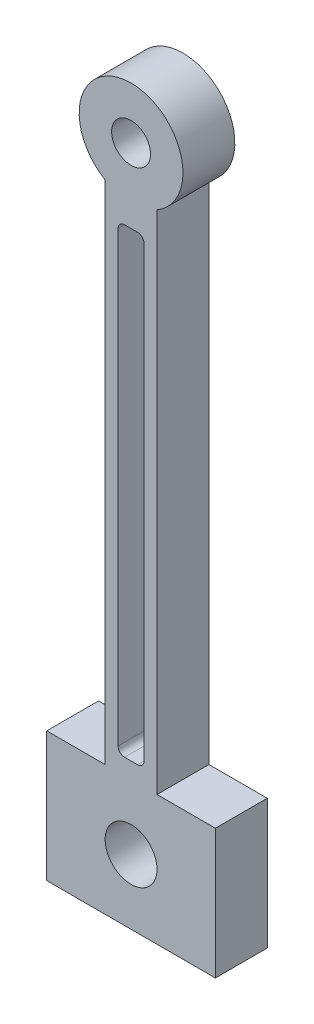
ISO-10303-21;
HEADER;
FILE_DESCRIPTION(('STEP AP214'),'2;1');
FILE_NAME('part.step','',(''),(''),'','','');
FILE_SCHEMA(('AUTOMOTIVE_DESIGN { 1 0 10303 214 1 1 1 1 }'));
ENDSEC;
DATA;
#1=APPLICATION_CONTEXT('core data for automotive mechanical design processes');
#2=APPLICATION_PROTOCOL_DEFINITION('international standard','automotive_design',2000,#1);
#3=PRODUCT_CONTEXT('',#1,'mechanical');
#4=PRODUCT('Part','Part','',(#3));
#5=PRODUCT_RELATED_PRODUCT_CATEGORY('part','',(#4));
#6=PRODUCT_DEFINITION_FORMATION('','',#4);
#7=PRODUCT_DEFINITION_CONTEXT('part definition',#1,'design');
#8=PRODUCT_DEFINITION('design','',#6,#7);
#9=PRODUCT_DEFINITION_SHAPE('','',#8);
#10=(LENGTH_UNIT() NAMED_UNIT(*) SI_UNIT(.MILLI.,.METRE.));
#11=(NAMED_UNIT(*) PLANE_ANGLE_UNIT() SI_UNIT($,.RADIAN.));
#12=(NAMED_UNIT(*) SI_UNIT($,.STERADIAN.) SOLID_ANGLE_UNIT());
#13=UNCERTAINTY_MEASURE_WITH_UNIT(LENGTH_MEASURE(1.E-05),#10,'distance_accuracy_value','');
#14=(GEOMETRIC_REPRESENTATION_CONTEXT(3) GLOBAL_UNCERTAINTY_ASSIGNED_CONTEXT((#13)) GLOBAL_UNIT_ASSIGNED_CONTEXT((#10,
#11,#12)) REPRESENTATION_CONTEXT('',''));
#15=CARTESIAN_POINT('',(0.,0.,0.));
#16=DIRECTION('',(0.,0.,1.));
#17=DIRECTION('',(1.,0.,0.));
#18=AXIS2_PLACEMENT_3D('',#15,#16,#17);
#19=CARTESIAN_POINT('',(-2.,0.,8.));
#20=DIRECTION('',(1.,0.,0.));
#21=DIRECTION('',(0.,1.,0.));
#22=AXIS2_PLACEMENT_3D('',#19,#20,#21);
#23=PLANE('',#22);
#24=DIRECTION('',(0.,-1.,0.));
#25=VECTOR('',#24,1.);
#26=CARTESIAN_POINT('',(-2.,0.,0.));
#27=LINE('',#26,#25);
#28=CARTESIAN_POINT('',(-2.,-12.4309632275777,0.));
#29=VERTEX_POINT('',#28);
#30=CARTESIAN_POINT('',(-1.99999999999999,-81.5205417627153,0.));
#31=VERTEX_POINT('',#30);
#32=EDGE_CURVE('E219',#29,#31,#27,.T.);
#33=ORIENTED_EDGE('',*,*,#32,.F.);
#34=DIRECTION('',(0.,0.,-1.));
#35=VECTOR('',#34,1.);
#36=CARTESIAN_POINT('',(-2.,-12.4309632275777,8.));
#37=LINE('',#36,#35);
#38=CARTESIAN_POINT('',(-2.,-12.4309632275777,8.));
#39=VERTEX_POINT('',#38);
#40=EDGE_CURVE('E11',#39,#29,#37,.T.);
#41=ORIENTED_EDGE('',*,*,#40,.F.);
#42=DIRECTION('',(0.,-1.,0.));
#43=VECTOR('',#42,1.);
#44=CARTESIAN_POINT('',(-2.,0.,8.));
#45=LINE('',#44,#43);
#46=CARTESIAN_POINT('',(-1.99999999999999,-81.5205417627153,8.));
#47=VERTEX_POINT('',#46);
#48=EDGE_CURVE('E556',#39,#47,#45,.T.);
#49=ORIENTED_EDGE('',*,*,#48,.T.);
#50=DIRECTION('',(0.,0.,-1.));
#51=VECTOR('',#50,1.);
#52=CARTESIAN_POINT('',(-1.99999999999999,-81.5205417627153,8.));
#53=LINE('',#52,#51);
#54=EDGE_CURVE('E59',#47,#31,#53,.T.);
#55=ORIENTED_EDGE('',*,*,#54,.T.);
#56=EDGE_LOOP('',(#33,#41,#49,#55));
#57=FACE_BOUND('',#56,.T.);
#58=ADVANCED_FACE('F40',(#57),#23,.T.);
#59=CARTESIAN_POINT('',(-1.,-12.4309632275777,8.));
#60=DIRECTION('',(0.,0.,-1.));
#61=DIRECTION('',(-1.,0.,0.));
#62=AXIS2_PLACEMENT_3D('',#59,#60,#61);
#63=CYLINDRICAL_SURFACE('',#62,1.);
#64=CARTESIAN_POINT('',(-1.,-12.4309632275777,0.));
#65=DIRECTION('',(0.,0.,1.));
#66=DIRECTION('',(1.,0.,0.));
#67=AXIS2_PLACEMENT_3D('',#64,#65,#66);
#68=CIRCLE('',#67,1.);
#69=CARTESIAN_POINT('',(-0.999999999999992,-11.4309632275777,0.));
#70=VERTEX_POINT('',#69);
#71=EDGE_CURVE('E221',#29,#70,#68,.F.);
#72=ORIENTED_EDGE('',*,*,#71,.T.);
#73=DIRECTION('',(0.,0.,-1.));
#74=VECTOR('',#73,1.);
#75=CARTESIAN_POINT('',(-0.999999999999992,-11.4309632275777,8.));
#76=LINE('',#75,#74);
#77=CARTESIAN_POINT('',(-0.999999999999992,-11.4309632275777,8.));
#78=VERTEX_POINT('',#77);
#79=EDGE_CURVE('E50',#78,#70,#76,.T.);
#80=ORIENTED_EDGE('',*,*,#79,.F.);
#81=CARTESIAN_POINT('',(-1.,-12.4309632275777,8.));
#82=DIRECTION('',(0.,0.,1.));
#83=DIRECTION('',(1.,0.,0.));
#84=AXIS2_PLACEMENT_3D('',#81,#82,#83);
#85=CIRCLE('',#84,1.);
#86=EDGE_CURVE('E551',#39,#78,#85,.F.);
#87=ORIENTED_EDGE('',*,*,#86,.F.);
#88=ORIENTED_EDGE('',*,*,#40,.T.);
#89=EDGE_LOOP('',(#72,#80,#87,#88));
#90=FACE_BOUND('',#89,.T.);
#91=ADVANCED_FACE('F316',(#90),#63,.F.);
#92=CARTESIAN_POINT('',(0.,-11.4309632275777,8.));
#93=DIRECTION('',(0.,1.,0.));
#94=DIRECTION('',(0.,0.,1.));
#95=AXIS2_PLACEMENT_3D('',#92,#93,#94);
#96=PLANE('',#95);
#97=DIRECTION('',(1.,0.,0.));
#98=VECTOR('',#97,1.);
#99=CARTESIAN_POINT('',(0.,-11.4309632275777,0.));
#100=LINE('',#99,#98);
#101=CARTESIAN_POINT('',(0.999999999999993,-11.4309632275777,0.));
#102=VERTEX_POINT('',#101);
#103=EDGE_CURVE('E224',#70,#102,#100,.T.);
#104=ORIENTED_EDGE('',*,*,#103,.T.);
#105=DIRECTION('',(0.,0.,-1.));
#106=VECTOR('',#105,1.);
#107=CARTESIAN_POINT('',(0.999999999999993,-11.4309632275777,8.));
#108=LINE('',#107,#106);
#109=CARTESIAN_POINT('',(0.999999999999993,-11.4309632275777,8.));
#110=VERTEX_POINT('',#109);
#111=EDGE_CURVE('E251',#110,#102,#108,.T.);
#112=ORIENTED_EDGE('',*,*,#111,.F.);
#113=DIRECTION('',(1.,0.,0.));
#114=VECTOR('',#113,1.);
#115=CARTESIAN_POINT('',(0.,-11.4309632275777,8.));
#116=LINE('',#115,#114);
#117=EDGE_CURVE('E549',#78,#110,#116,.T.);
#118=ORIENTED_EDGE('',*,*,#117,.F.);
#119=ORIENTED_EDGE('',*,*,#79,.T.);
#120=EDGE_LOOP('',(#104,#112,#118,#119));
#121=FACE_BOUND('',#120,.T.);
#122=ADVANCED_FACE('F321',(#121),#96,.F.);
#123=CARTESIAN_POINT('',(1.,-12.4309632275777,8.));
#124=DIRECTION('',(0.,0.,-1.));
#125=DIRECTION('',(-1.,0.,0.));
#126=AXIS2_PLACEMENT_3D('',#123,#124,#125);
#127=CYLINDRICAL_SURFACE('',#126,1.);
#128=CARTESIAN_POINT('',(1.,-12.4309632275777,0.));
#129=DIRECTION('',(0.,0.,1.));
#130=DIRECTION('',(1.,0.,0.));
#131=AXIS2_PLACEMENT_3D('',#128,#129,#130);
#132=CIRCLE('',#131,1.);
#133=CARTESIAN_POINT('',(2.,-12.4309632275777,0.));
#134=VERTEX_POINT('',#133);
#135=EDGE_CURVE('E227',#134,#102,#132,.T.);
#136=ORIENTED_EDGE('',*,*,#135,.F.);
#137=DIRECTION('',(0.,0.,-1.));
#138=VECTOR('',#137,1.);
#139=CARTESIAN_POINT('',(2.,-12.4309632275777,8.));
#140=LINE('',#139,#138);
#141=CARTESIAN_POINT('',(2.,-12.4309632275777,8.));
#142=VERTEX_POINT('',#141);
#143=EDGE_CURVE('E249',#142,#134,#140,.T.);
#144=ORIENTED_EDGE('',*,*,#143,.F.);
#145=CARTESIAN_POINT('',(1.,-12.4309632275777,8.));
#146=DIRECTION('',(0.,0.,1.));
#147=DIRECTION('',(1.,0.,0.));
#148=AXIS2_PLACEMENT_3D('',#145,#146,#147);
#149=CIRCLE('',#148,1.);
#150=EDGE_CURVE('E548',#142,#110,#149,.T.);
#151=ORIENTED_EDGE('',*,*,#150,.T.);
#152=ORIENTED_EDGE('',*,*,#111,.T.);
#153=EDGE_LOOP('',(#136,#144,#151,#152));
#154=FACE_BOUND('',#153,.T.);
#155=ADVANCED_FACE('F493',(#154),#127,.F.);
#156=CARTESIAN_POINT('',(2.,0.,8.));
#157=DIRECTION('',(1.,0.,0.));
#158=DIRECTION('',(0.,1.,0.));
#159=AXIS2_PLACEMENT_3D('',#156,#157,#158);
#160=PLANE('',#159);
#161=DIRECTION('',(0.,-1.,0.));
#162=VECTOR('',#161,1.);
#163=CARTESIAN_POINT('',(2.,0.,0.));
#164=LINE('',#163,#162);
#165=CARTESIAN_POINT('',(2.00000000000001,-81.5205417627153,0.));
#166=VERTEX_POINT('',#165);
#167=EDGE_CURVE('E230',#134,#166,#164,.T.);
#168=ORIENTED_EDGE('',*,*,#167,.T.);
#169=DIRECTION('',(0.,0.,-1.));
#170=VECTOR('',#169,1.);
#171=CARTESIAN_POINT('',(2.00000000000001,-81.5205417627153,8.));
#172=LINE('',#171,#170);
#173=CARTESIAN_POINT('',(2.00000000000001,-81.5205417627153,8.));
#174=VERTEX_POINT('',#173);
#175=EDGE_CURVE('E169',#174,#166,#172,.T.);
#176=ORIENTED_EDGE('',*,*,#175,.F.);
#177=DIRECTION('',(0.,-1.,0.));
#178=VECTOR('',#177,1.);
#179=CARTESIAN_POINT('',(2.,0.,8.));
#180=LINE('',#179,#178);
#181=EDGE_CURVE('E180',#142,#174,#180,.T.);
#182=ORIENTED_EDGE('',*,*,#181,.F.);
#183=ORIENTED_EDGE('',*,*,#143,.T.);
#184=EDGE_LOOP('',(#168,#176,#182,#183));
#185=FACE_BOUND('',#184,.T.);
#186=ADVANCED_FACE('F483',(#185),#160,.F.);
#187=CARTESIAN_POINT('',(1.00000000000001,-81.5205417627153,8.));
#188=DIRECTION('',(0.,0.,-1.));
#189=DIRECTION('',(-1.,0.,0.));
#190=AXIS2_PLACEMENT_3D('',#187,#188,#189);
#191=CYLINDRICAL_SURFACE('',#190,1.);
#192=CARTESIAN_POINT('',(1.00000000000001,-81.5205417627153,0.));
#193=DIRECTION('',(0.,0.,1.));
#194=DIRECTION('',(1.,0.,0.));
#195=AXIS2_PLACEMENT_3D('',#192,#193,#194);
#196=CIRCLE('',#195,1.);
#197=CARTESIAN_POINT('',(1.,-82.5205417627153,0.));
#198=VERTEX_POINT('',#197);
#199=EDGE_CURVE('E165',#198,#166,#196,.T.);
#200=ORIENTED_EDGE('',*,*,#199,.F.);
#201=DIRECTION('',(0.,0.,-1.));
#202=VECTOR('',#201,1.);
#203=CARTESIAN_POINT('',(1.,-82.5205417627153,8.));
#204=LINE('',#203,#202);
#205=CARTESIAN_POINT('',(1.,-82.5205417627153,8.));
#206=VERTEX_POINT('',#205);
#207=EDGE_CURVE('E160',#206,#198,#204,.T.);
#208=ORIENTED_EDGE('',*,*,#207,.F.);
#209=CARTESIAN_POINT('',(1.00000000000001,-81.5205417627153,8.));
#210=DIRECTION('',(0.,0.,1.));
#211=DIRECTION('',(1.,0.,0.));
#212=AXIS2_PLACEMENT_3D('',#209,#210,#211);
#213=CIRCLE('',#212,1.);
#214=EDGE_CURVE('E163',#206,#174,#213,.T.);
#215=ORIENTED_EDGE('',*,*,#214,.T.);
#216=ORIENTED_EDGE('',*,*,#175,.T.);
#217=EDGE_LOOP('',(#200,#208,#215,#216));
#218=FACE_BOUND('',#217,.T.);
#219=ADVANCED_FACE('F162',(#218),#191,.F.);
#220=CARTESIAN_POINT('',(0.,-82.5205417627153,8.));
#221=DIRECTION('',(0.,1.,0.));
#222=DIRECTION('',(0.,0.,1.));
#223=AXIS2_PLACEMENT_3D('',#220,#221,#222);
#224=PLANE('',#223);
#225=DIRECTION('',(1.,0.,0.));
#226=VECTOR('',#225,1.);
#227=CARTESIAN_POINT('',(0.,-82.5205417627153,0.));
#228=LINE('',#227,#226);
#229=CARTESIAN_POINT('',(-0.999999999999984,-82.5205417627153,0.));
#230=VERTEX_POINT('',#229);
#231=EDGE_CURVE('E234',#230,#198,#228,.T.);
#232=ORIENTED_EDGE('',*,*,#231,.F.);
#233=DIRECTION('',(0.,0.,-1.));
#234=VECTOR('',#233,1.);
#235=CARTESIAN_POINT('',(-0.999999999999984,-82.5205417627153,8.));
#236=LINE('',#235,#234);
#237=CARTESIAN_POINT('',(-0.999999999999984,-82.5205417627153,8.));
#238=VERTEX_POINT('',#237);
#239=EDGE_CURVE('E108',#238,#230,#236,.T.);
#240=ORIENTED_EDGE('',*,*,#239,.F.);
#241=DIRECTION('',(1.,0.,0.));
#242=VECTOR('',#241,1.);
#243=CARTESIAN_POINT('',(0.,-82.5205417627153,8.));
#244=LINE('',#243,#242);
#245=EDGE_CURVE('E177',#238,#206,#244,.T.);
#246=ORIENTED_EDGE('',*,*,#245,.T.);
#247=ORIENTED_EDGE('',*,*,#207,.T.);
#248=EDGE_LOOP('',(#232,#240,#246,#247));
#249=FACE_BOUND('',#248,.T.);
#250=ADVANCED_FACE('F183',(#249),#224,.T.);
#251=CARTESIAN_POINT('',(4.,0.,8.));
#252=DIRECTION('',(1.,0.,0.));
#253=DIRECTION('',(0.,1.,0.));
#254=AXIS2_PLACEMENT_3D('',#251,#252,#253);
#255=PLANE('',#254);
#256=DIRECTION('',(0.,-1.,0.));
#257=VECTOR('',#256,1.);
#258=CARTESIAN_POINT('',(4.,0.,0.));
#259=LINE('',#258,#257);
#260=CARTESIAN_POINT('',(4.,-6.92820323027551,0.));
#261=VERTEX_POINT('',#260);
#262=CARTESIAN_POINT('',(3.99999999999999,-85.,0.));
#263=VERTEX_POINT('',#262);
#264=EDGE_CURVE('E196',#261,#263,#259,.T.);
#265=ORIENTED_EDGE('',*,*,#264,.F.);
#266=DIRECTION('',(0.,0.,-1.));
#267=VECTOR('',#266,1.);
#268=CARTESIAN_POINT('',(4.,-6.92820323027551,8.));
#269=LINE('',#268,#267);
#270=CARTESIAN_POINT('',(4.,-6.92820323027551,8.));
#271=VERTEX_POINT('',#270);
#272=EDGE_CURVE('E44',#271,#261,#269,.T.);
#273=ORIENTED_EDGE('',*,*,#272,.F.);
#274=DIRECTION('',(0.,-1.,0.));
#275=VECTOR('',#274,1.);
#276=CARTESIAN_POINT('',(4.,0.,8.));
#277=LINE('',#276,#275);
#278=CARTESIAN_POINT('',(3.99999999999999,-85.,8.));
#279=VERTEX_POINT('',#278);
#280=EDGE_CURVE('E245',#271,#279,#277,.T.);
#281=ORIENTED_EDGE('',*,*,#280,.T.);
#282=DIRECTION('',(0.,0.,-1.));
#283=VECTOR('',#282,1.);
#284=CARTESIAN_POINT('',(3.99999999999999,-85.,8.));
#285=LINE('',#284,#283);
#286=EDGE_CURVE('E195',#279,#263,#285,.T.);
#287=ORIENTED_EDGE('',*,*,#286,.T.);
#288=EDGE_LOOP('',(#265,#273,#281,#287));
#289=FACE_BOUND('',#288,.T.);
#290=ADVANCED_FACE('F42',(#289),#255,.T.);
#291=CARTESIAN_POINT('',(0.,0.,8.));
#292=DIRECTION('',(0.,0.,-1.));
#293=DIRECTION('',(-1.,0.,0.));
#294=AXIS2_PLACEMENT_3D('',#291,#292,#293);
#295=CYLINDRICAL_SURFACE('',#294,8.);
#296=CARTESIAN_POINT('',(0.,0.,0.));
#297=DIRECTION('',(0.,0.,1.));
#298=DIRECTION('',(1.,0.,0.));
#299=AXIS2_PLACEMENT_3D('',#296,#297,#298);
#300=CIRCLE('',#299,8.);
#301=CARTESIAN_POINT('',(-4.,-6.92820323027551,0.));
#302=VERTEX_POINT('',#301);
#303=EDGE_CURVE('E199',#261,#302,#300,.T.);
#304=ORIENTED_EDGE('',*,*,#303,.T.);
#305=DIRECTION('',(0.,0.,-1.));
#306=VECTOR('',#305,1.);
#307=CARTESIAN_POINT('',(-4.,-6.92820323027551,8.));
#308=LINE('',#307,#306);
#309=CARTESIAN_POINT('',(-4.,-6.92820323027551,8.));
#310=VERTEX_POINT('',#309);
#311=EDGE_CURVE('E265',#310,#302,#308,.T.);
#312=ORIENTED_EDGE('',*,*,#311,.F.);
#313=CARTESIAN_POINT('',(0.,0.,8.));
#314=DIRECTION('',(0.,0.,1.));
#315=DIRECTION('',(1.,0.,0.));
#316=AXIS2_PLACEMENT_3D('',#313,#314,#315);
#317=CIRCLE('',#316,8.);
#318=EDGE_CURVE('E274',#271,#310,#317,.T.);
#319=ORIENTED_EDGE('',*,*,#318,.F.);
#320=ORIENTED_EDGE('',*,*,#272,.T.);
#321=EDGE_LOOP('',(#304,#312,#319,#320));
#322=FACE_BOUND('',#321,.T.);
#323=ADVANCED_FACE('F273',(#322),#295,.T.);
#324=CARTESIAN_POINT('',(-4.,0.,8.));
#325=DIRECTION('',(1.,0.,0.));
#326=DIRECTION('',(0.,1.,0.));
#327=AXIS2_PLACEMENT_3D('',#324,#325,#326);
#328=PLANE('',#327);
#329=DIRECTION('',(0.,-1.,0.));
#330=VECTOR('',#329,1.);
#331=CARTESIAN_POINT('',(-4.,0.,0.));
#332=LINE('',#331,#330);
#333=CARTESIAN_POINT('',(-3.99999999999999,-85.,0.));
#334=VERTEX_POINT('',#333);
#335=EDGE_CURVE('E201',#302,#334,#332,.T.);
#336=ORIENTED_EDGE('',*,*,#335,.T.);
#337=DIRECTION('',(0.,0.,-1.));
#338=VECTOR('',#337,1.);
#339=CARTESIAN_POINT('',(-3.99999999999999,-85.,8.));
#340=LINE('',#339,#338);
#341=CARTESIAN_POINT('',(-3.99999999999999,-85.,8.));
#342=VERTEX_POINT('',#341);
#343=EDGE_CURVE('E264',#342,#334,#340,.T.);
#344=ORIENTED_EDGE('',*,*,#343,.F.);
#345=DIRECTION('',(0.,-1.,0.));
#346=VECTOR('',#345,1.);
#347=CARTESIAN_POINT('',(-4.,0.,8.));
#348=LINE('',#347,#346);
#349=EDGE_CURVE('E566',#310,#342,#348,.T.);
#350=ORIENTED_EDGE('',*,*,#349,.F.);
#351=ORIENTED_EDGE('',*,*,#311,.T.);
#352=EDGE_LOOP('',(#336,#344,#350,#351));
#353=FACE_BOUND('',#352,.T.);
#354=ADVANCED_FACE('F306',(#353),#328,.F.);
#355=CARTESIAN_POINT('',(0.,-85.,8.));
#356=DIRECTION('',(0.,1.,0.));
#357=DIRECTION('',(0.,0.,1.));
#358=AXIS2_PLACEMENT_3D('',#355,#356,#357);
#359=PLANE('',#358);
#360=DIRECTION('',(1.,0.,0.));
#361=VECTOR('',#360,1.);
#362=CARTESIAN_POINT('',(0.,-85.,0.));
#363=LINE('',#362,#361);
#364=CARTESIAN_POINT('',(-13.,-85.,0.));
#365=VERTEX_POINT('',#364);
#366=EDGE_CURVE('E204',#365,#334,#363,.T.);
#367=ORIENTED_EDGE('',*,*,#366,.F.);
#368=DIRECTION('',(0.,0.,-1.));
#369=VECTOR('',#368,1.);
#370=CARTESIAN_POINT('',(-13.,-85.,8.));
#371=LINE('',#370,#369);
#372=CARTESIAN_POINT('',(-13.,-85.,8.));
#373=VERTEX_POINT('',#372);
#374=EDGE_CURVE('E262',#373,#365,#371,.T.);
#375=ORIENTED_EDGE('',*,*,#374,.F.);
#376=DIRECTION('',(1.,0.,0.));
#377=VECTOR('',#376,1.);
#378=CARTESIAN_POINT('',(0.,-85.,8.));
#379=LINE('',#378,#377);
#380=EDGE_CURVE('E305',#373,#342,#379,.T.);
#381=ORIENTED_EDGE('',*,*,#380,.T.);
#382=ORIENTED_EDGE('',*,*,#343,.T.);
#383=EDGE_LOOP('',(#367,#375,#381,#382));
#384=FACE_BOUND('',#383,.T.);
#385=ADVANCED_FACE('F300',(#384),#359,.T.);
#386=CARTESIAN_POINT('',(-13.,0.,8.));
#387=DIRECTION('',(1.,0.,0.));
#388=DIRECTION('',(0.,1.,0.));
#389=AXIS2_PLACEMENT_3D('',#386,#387,#388);
#390=PLANE('',#389);
#391=DIRECTION('',(0.,-1.,0.));
#392=VECTOR('',#391,1.);
#393=CARTESIAN_POINT('',(-13.,0.,0.));
#394=LINE('',#393,#392);
#395=CARTESIAN_POINT('',(-13.,-105.,0.));
#396=VERTEX_POINT('',#395);
#397=EDGE_CURVE('E207',#365,#396,#394,.T.);
#398=ORIENTED_EDGE('',*,*,#397,.T.);
#399=DIRECTION('',(0.,0.,-1.));
#400=VECTOR('',#399,1.);
#401=CARTESIAN_POINT('',(-13.,-105.,8.));
#402=LINE('',#401,#400);
#403=CARTESIAN_POINT('',(-13.,-105.,8.));
#404=VERTEX_POINT('',#403);
#405=EDGE_CURVE('E260',#404,#396,#402,.T.);
#406=ORIENTED_EDGE('',*,*,#405,.F.);
#407=DIRECTION('',(0.,-1.,0.));
#408=VECTOR('',#407,1.);
#409=CARTESIAN_POINT('',(-13.,0.,8.));
#410=LINE('',#409,#408);
#411=EDGE_CURVE('E563',#373,#404,#410,.T.);
#412=ORIENTED_EDGE('',*,*,#411,.F.);
#413=ORIENTED_EDGE('',*,*,#374,.T.);
#414=EDGE_LOOP('',(#398,#406,#412,#413));
#415=FACE_BOUND('',#414,.T.);
#416=ADVANCED_FACE('F313',(#415),#390,.F.);
#417=CARTESIAN_POINT('',(0.,-105.,8.));
#418=DIRECTION('',(0.,-1.,0.));
#419=DIRECTION('',(0.,0.,-1.));
#420=AXIS2_PLACEMENT_3D('',#417,#418,#419);
#421=PLANE('',#420);
#422=DIRECTION('',(-1.,0.,0.));
#423=VECTOR('',#422,1.);
#424=CARTESIAN_POINT('',(0.,-105.,0.));
#425=LINE('',#424,#423);
#426=CARTESIAN_POINT('',(13.,-105.,0.));
#427=VERTEX_POINT('',#426);
#428=EDGE_CURVE('E210',#427,#396,#425,.T.);
#429=ORIENTED_EDGE('',*,*,#428,.F.);
#430=DIRECTION('',(0.,0.,-1.));
#431=VECTOR('',#430,1.);
#432=CARTESIAN_POINT('',(13.,-105.,8.));
#433=LINE('',#432,#431);
#434=CARTESIAN_POINT('',(13.,-105.,8.));
#435=VERTEX_POINT('',#434);
#436=EDGE_CURVE('E258',#435,#427,#433,.T.);
#437=ORIENTED_EDGE('',*,*,#436,.F.);
#438=DIRECTION('',(-1.,0.,0.));
#439=VECTOR('',#438,1.);
#440=CARTESIAN_POINT('',(0.,-105.,8.));
#441=LINE('',#440,#439);
#442=EDGE_CURVE('E561',#435,#404,#441,.T.);
#443=ORIENTED_EDGE('',*,*,#442,.T.);
#444=ORIENTED_EDGE('',*,*,#405,.T.);
#445=EDGE_LOOP('',(#429,#437,#443,#444));
#446=FACE_BOUND('',#445,.T.);
#447=ADVANCED_FACE('F294',(#446),#421,.T.);
#448=CARTESIAN_POINT('',(13.,0.,8.));
#449=DIRECTION('',(1.,0.,0.));
#450=DIRECTION('',(0.,1.,0.));
#451=AXIS2_PLACEMENT_3D('',#448,#449,#450);
#452=PLANE('',#451);
#453=DIRECTION('',(0.,-1.,0.));
#454=VECTOR('',#453,1.);
#455=CARTESIAN_POINT('',(13.,0.,0.));
#456=LINE('',#455,#454);
#457=CARTESIAN_POINT('',(13.,-85.,0.));
#458=VERTEX_POINT('',#457);
#459=EDGE_CURVE('E213',#458,#427,#456,.T.);
#460=ORIENTED_EDGE('',*,*,#459,.F.);
#461=DIRECTION('',(0.,0.,-1.));
#462=VECTOR('',#461,1.);
#463=CARTESIAN_POINT('',(13.,-85.,8.));
#464=LINE('',#463,#462);
#465=CARTESIAN_POINT('',(13.,-85.,8.));
#466=VERTEX_POINT('',#465);
#467=EDGE_CURVE('E256',#466,#458,#464,.T.);
#468=ORIENTED_EDGE('',*,*,#467,.F.);
#469=DIRECTION('',(0.,-1.,0.));
#470=VECTOR('',#469,1.);
#471=CARTESIAN_POINT('',(13.,0.,8.));
#472=LINE('',#471,#470);
#473=EDGE_CURVE('E290',#466,#435,#472,.T.);
#474=ORIENTED_EDGE('',*,*,#473,.T.);
#475=ORIENTED_EDGE('',*,*,#436,.T.);
#476=EDGE_LOOP('',(#460,#468,#474,#475));
#477=FACE_BOUND('',#476,.T.);
#478=ADVANCED_FACE('F286',(#477),#452,.T.);
#479=CARTESIAN_POINT('',(0.,0.,8.));
#480=DIRECTION('',(0.,0.,-1.));
#481=DIRECTION('',(-1.,0.,0.));
#482=AXIS2_PLACEMENT_3D('',#479,#480,#481);
#483=CYLINDRICAL_SURFACE('',#482,3.);
#484=CARTESIAN_POINT('',(0.,0.,8.));
#485=DIRECTION('',(0.,0.,1.));
#486=DIRECTION('',(1.,0.,0.));
#487=AXIS2_PLACEMENT_3D('',#484,#485,#486);
#488=CIRCLE('',#487,3.);
#489=CARTESIAN_POINT('',(3.,0.,8.));
#490=VERTEX_POINT('',#489);
#491=EDGE_CURVE('E186',#490,#490,#488,.T.);
#492=ORIENTED_EDGE('',*,*,#491,.T.);
#493=EDGE_LOOP('',(#492));
#494=FACE_BOUND('',#493,.T.);
#495=CARTESIAN_POINT('',(0.,0.,0.));
#496=DIRECTION('',(0.,0.,1.));
#497=DIRECTION('',(1.,0.,0.));
#498=AXIS2_PLACEMENT_3D('',#495,#496,#497);
#499=CIRCLE('',#498,3.);
#500=CARTESIAN_POINT('',(3.,0.,0.));
#501=VERTEX_POINT('',#500);
#502=EDGE_CURVE('E239',#501,#501,#499,.T.);
#503=ORIENTED_EDGE('',*,*,#502,.F.);
#504=EDGE_LOOP('',(#503));
#505=FACE_BOUND('',#504,.T.);
#506=ADVANCED_FACE('F332',(#494,#505),#483,.F.);
#507=CARTESIAN_POINT('',(-0.999999999999992,-81.5205417627153,8.));
#508=DIRECTION('',(0.,0.,-1.));
#509=DIRECTION('',(-1.,0.,0.));
#510=AXIS2_PLACEMENT_3D('',#507,#508,#509);
#511=CYLINDRICAL_SURFACE('',#510,1.);
#512=CARTESIAN_POINT('',(-0.999999999999992,-81.5205417627153,0.));
#513=DIRECTION('',(0.,0.,1.));
#514=DIRECTION('',(1.,0.,0.));
#515=AXIS2_PLACEMENT_3D('',#512,#513,#514);
#516=CIRCLE('',#515,1.);
#517=EDGE_CURVE('E236',#31,#230,#516,.T.);
#518=ORIENTED_EDGE('',*,*,#517,.F.);
#519=ORIENTED_EDGE('',*,*,#54,.F.);
#520=CARTESIAN_POINT('',(-0.999999999999992,-81.5205417627153,8.));
#521=DIRECTION('',(0.,0.,1.));
#522=DIRECTION('',(1.,0.,0.));
#523=AXIS2_PLACEMENT_3D('',#520,#521,#522);
#524=CIRCLE('',#523,1.);
#525=EDGE_CURVE('E184',#47,#238,#524,.T.);
#526=ORIENTED_EDGE('',*,*,#525,.T.);
#527=ORIENTED_EDGE('',*,*,#239,.T.);
#528=EDGE_LOOP('',(#518,#519,#526,#527));
#529=FACE_BOUND('',#528,.T.);
#530=ADVANCED_FACE('F329',(#529),#511,.F.);
#531=CARTESIAN_POINT('',(0.,-85.,8.));
#532=DIRECTION('',(0.,-1.,0.));
#533=DIRECTION('',(0.,0.,-1.));
#534=AXIS2_PLACEMENT_3D('',#531,#532,#533);
#535=PLANE('',#534);
#536=DIRECTION('',(-1.,0.,0.));
#537=VECTOR('',#536,1.);
#538=CARTESIAN_POINT('',(0.,-85.,0.));
#539=LINE('',#538,#537);
#540=EDGE_CURVE('E216',#458,#263,#539,.T.);
#541=ORIENTED_EDGE('',*,*,#540,.T.);
#542=ORIENTED_EDGE('',*,*,#286,.F.);
#543=DIRECTION('',(-1.,0.,0.));
#544=VECTOR('',#543,1.);
#545=CARTESIAN_POINT('',(0.,-85.,8.));
#546=LINE('',#545,#544);
#547=EDGE_CURVE('E558',#466,#279,#546,.T.);
#548=ORIENTED_EDGE('',*,*,#547,.F.);
#549=ORIENTED_EDGE('',*,*,#467,.T.);
#550=EDGE_LOOP('',(#541,#542,#548,#549));
#551=FACE_BOUND('',#550,.T.);
#552=ADVANCED_FACE('F283',(#551),#535,.F.);
#553=CARTESIAN_POINT('',(0.,-95.,8.));
#554=DIRECTION('',(0.,0.,-1.));
#555=DIRECTION('',(-1.,0.,0.));
#556=AXIS2_PLACEMENT_3D('',#553,#554,#555);
#557=CYLINDRICAL_SURFACE('',#556,4.);
#558=CARTESIAN_POINT('',(0.,-95.,8.));
#559=DIRECTION('',(0.,0.,1.));
#560=DIRECTION('',(1.,0.,0.));
#561=AXIS2_PLACEMENT_3D('',#558,#559,#560);
#562=CIRCLE('',#561,4.);
#563=CARTESIAN_POINT('',(4.00000000000001,-95.,8.));
#564=VERTEX_POINT('',#563);
#565=EDGE_CURVE('E192',#564,#564,#562,.T.);
#566=ORIENTED_EDGE('',*,*,#565,.T.);
#567=EDGE_LOOP('',(#566));
#568=FACE_BOUND('',#567,.T.);
#569=CARTESIAN_POINT('',(0.,-95.,0.));
#570=DIRECTION('',(0.,0.,1.));
#571=DIRECTION('',(1.,0.,0.));
#572=AXIS2_PLACEMENT_3D('',#569,#570,#571);
#573=CIRCLE('',#572,4.);
#574=CARTESIAN_POINT('',(4.00000000000001,-95.,0.));
#575=VERTEX_POINT('',#574);
#576=EDGE_CURVE('E242',#575,#575,#573,.T.);
#577=ORIENTED_EDGE('',*,*,#576,.F.);
#578=EDGE_LOOP('',(#577));
#579=FACE_BOUND('',#578,.T.);
#580=ADVANCED_FACE('F328',(#568,#579),#557,.F.);
#581=CARTESIAN_POINT('',(0.,0.,8.));
#582=DIRECTION('',(0.,0.,1.));
#583=DIRECTION('',(1.,0.,0.));
#584=AXIS2_PLACEMENT_3D('',#581,#582,#583);
#585=PLANE('',#584);
#586=ORIENTED_EDGE('',*,*,#280,.F.);
#587=ORIENTED_EDGE('',*,*,#318,.T.);
#588=ORIENTED_EDGE('',*,*,#349,.T.);
#589=ORIENTED_EDGE('',*,*,#380,.F.);
#590=ORIENTED_EDGE('',*,*,#411,.T.);
#591=ORIENTED_EDGE('',*,*,#442,.F.);
#592=ORIENTED_EDGE('',*,*,#473,.F.);
#593=ORIENTED_EDGE('',*,*,#547,.T.);
#594=EDGE_LOOP('',(#586,#587,#588,#589,#590,#591,#592,#593));
#595=FACE_BOUND('',#594,.T.);
#596=ORIENTED_EDGE('',*,*,#48,.F.);
#597=ORIENTED_EDGE('',*,*,#86,.T.);
#598=ORIENTED_EDGE('',*,*,#117,.T.);
#599=ORIENTED_EDGE('',*,*,#150,.F.);
#600=ORIENTED_EDGE('',*,*,#181,.T.);
#601=ORIENTED_EDGE('',*,*,#214,.F.);
#602=ORIENTED_EDGE('',*,*,#245,.F.);
#603=ORIENTED_EDGE('',*,*,#525,.F.);
#604=EDGE_LOOP('',(#596,#597,#598,#599,#600,#601,#602,#603));
#605=FACE_BOUND('',#604,.T.);
#606=ORIENTED_EDGE('',*,*,#491,.F.);
#607=EDGE_LOOP('',(#606));
#608=FACE_BOUND('',#607,.T.);
#609=ORIENTED_EDGE('',*,*,#565,.F.);
#610=EDGE_LOOP('',(#609));
#611=FACE_BOUND('',#610,.T.);
#612=ADVANCED_FACE('F174',(#595,#605,#608,#611),#585,.T.);
#613=CARTESIAN_POINT('',(0.,0.,0.));
#614=DIRECTION('',(0.,0.,1.));
#615=DIRECTION('',(1.,0.,0.));
#616=AXIS2_PLACEMENT_3D('',#613,#614,#615);
#617=PLANE('',#616);
#618=ORIENTED_EDGE('',*,*,#264,.T.);
#619=ORIENTED_EDGE('',*,*,#540,.F.);
#620=ORIENTED_EDGE('',*,*,#459,.T.);
#621=ORIENTED_EDGE('',*,*,#428,.T.);
#622=ORIENTED_EDGE('',*,*,#397,.F.);
#623=ORIENTED_EDGE('',*,*,#366,.T.);
#624=ORIENTED_EDGE('',*,*,#335,.F.);
#625=ORIENTED_EDGE('',*,*,#303,.F.);
#626=EDGE_LOOP('',(#618,#619,#620,#621,#622,#623,#624,#625));
#627=FACE_BOUND('',#626,.T.);
#628=ORIENTED_EDGE('',*,*,#32,.T.);
#629=ORIENTED_EDGE('',*,*,#517,.T.);
#630=ORIENTED_EDGE('',*,*,#231,.T.);
#631=ORIENTED_EDGE('',*,*,#199,.T.);
#632=ORIENTED_EDGE('',*,*,#167,.F.);
#633=ORIENTED_EDGE('',*,*,#135,.T.);
#634=ORIENTED_EDGE('',*,*,#103,.F.);
#635=ORIENTED_EDGE('',*,*,#71,.F.);
#636=EDGE_LOOP('',(#628,#629,#630,#631,#632,#633,#634,#635));
#637=FACE_BOUND('',#636,.T.);
#638=ORIENTED_EDGE('',*,*,#502,.T.);
#639=EDGE_LOOP('',(#638));
#640=FACE_BOUND('',#639,.T.);
#641=ORIENTED_EDGE('',*,*,#576,.T.);
#642=EDGE_LOOP('',(#641));
#643=FACE_BOUND('',#642,.T.);
#644=ADVANCED_FACE('F277',(#627,#637,#640,#643),#617,.F.);
#645=CLOSED_SHELL('',(#58,#91,#122,#155,#186,#219,#250,#290,#323,#354,#385,#416,#447,#478,#506,
#530,#552,#580,#612,#644));
#646=MANIFOLD_SOLID_BREP('B2',#645);
#647=ADVANCED_BREP_SHAPE_REPRESENTATION('',(#18,#646),#14);
#648=SHAPE_DEFINITION_REPRESENTATION(#9,#647);
ENDSEC;
END-ISO-10303-21;
